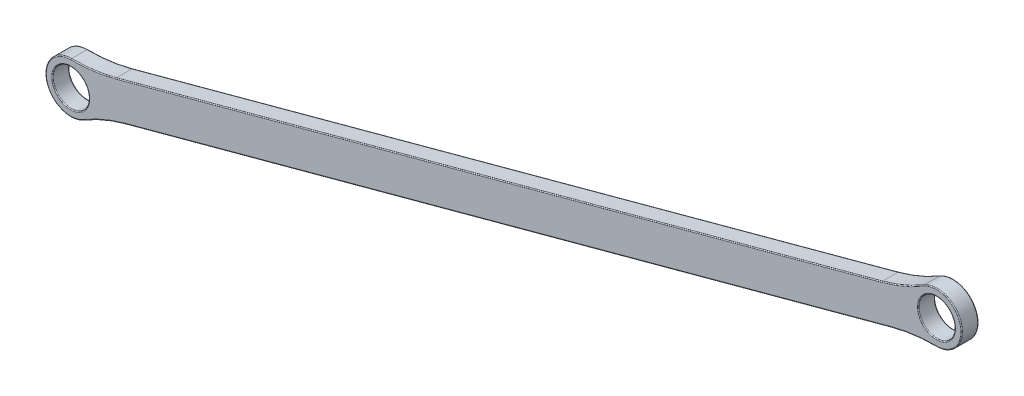
ISO-10303-21;
HEADER;
FILE_DESCRIPTION(('STEP AP214'),'2;1');
FILE_NAME('part.step','',(''),(''),'','','');
FILE_SCHEMA(('AUTOMOTIVE_DESIGN { 1 0 10303 214 1 1 1 1 }'));
ENDSEC;
DATA;
#1=APPLICATION_CONTEXT('core data for automotive mechanical design processes');
#2=APPLICATION_PROTOCOL_DEFINITION('international standard','automotive_design',2000,#1);
#3=PRODUCT_CONTEXT('',#1,'mechanical');
#4=PRODUCT('Part','Part','',(#3));
#5=PRODUCT_RELATED_PRODUCT_CATEGORY('part','',(#4));
#6=PRODUCT_DEFINITION_FORMATION('','',#4);
#7=PRODUCT_DEFINITION_CONTEXT('part definition',#1,'design');
#8=PRODUCT_DEFINITION('design','',#6,#7);
#9=PRODUCT_DEFINITION_SHAPE('','',#8);
#10=(LENGTH_UNIT() NAMED_UNIT(*) SI_UNIT(.MILLI.,.METRE.));
#11=(NAMED_UNIT(*) PLANE_ANGLE_UNIT() SI_UNIT($,.RADIAN.));
#12=(NAMED_UNIT(*) SI_UNIT($,.STERADIAN.) SOLID_ANGLE_UNIT());
#13=UNCERTAINTY_MEASURE_WITH_UNIT(LENGTH_MEASURE(1.E-05),#10,'distance_accuracy_value','');
#14=(GEOMETRIC_REPRESENTATION_CONTEXT(3) GLOBAL_UNCERTAINTY_ASSIGNED_CONTEXT((#13)) GLOBAL_UNIT_ASSIGNED_CONTEXT((#10,
#11,#12)) REPRESENTATION_CONTEXT('',''));
#15=CARTESIAN_POINT('',(0.,0.,0.));
#16=DIRECTION('',(0.,0.,1.));
#17=DIRECTION('',(1.,0.,0.));
#18=AXIS2_PLACEMENT_3D('',#15,#16,#17);
#19=CARTESIAN_POINT('',(-213.595931630714,188.0480555057,-3.));
#20=DIRECTION('',(0.,0.,1.));
#21=DIRECTION('',(1.,0.,0.));
#22=AXIS2_PLACEMENT_3D('',#19,#20,#21);
#23=CYLINDRICAL_SURFACE('',#22,4.49999999999999);
#24=DIRECTION('',(0.,0.,1.));
#25=VECTOR('',#24,1.);
#26=CARTESIAN_POINT('',(-213.568137790071,192.547969671817,-3.));
#27=LINE('',#26,#25);
#28=CARTESIAN_POINT('',(-213.568137790071,192.547969671817,-0.15));
#29=VERTEX_POINT('',#28);
#30=CARTESIAN_POINT('',(-213.568137790071,192.547969671817,-2.85));
#31=VERTEX_POINT('',#30);
#32=EDGE_CURVE('E306',#29,#31,#27,.F.);
#33=ORIENTED_EDGE('',*,*,#32,.T.);
#34=CARTESIAN_POINT('',(-213.595931630714,188.0480555057,-2.85));
#35=DIRECTION('',(0.,0.,1.));
#36=DIRECTION('',(1.,0.,0.));
#37=AXIS2_PLACEMENT_3D('',#34,#35,#36);
#38=CIRCLE('',#37,4.49999999999999);
#39=CARTESIAN_POINT('',(-211.306122055367,184.174197982681,-2.85));
#40=VERTEX_POINT('',#39);
#41=EDGE_CURVE('E221',#31,#40,#38,.T.);
#42=ORIENTED_EDGE('',*,*,#41,.T.);
#43=DIRECTION('',(0.,0.,1.));
#44=VECTOR('',#43,1.);
#45=CARTESIAN_POINT('',(-211.306122055367,184.174197982681,-3.));
#46=LINE('',#45,#44);
#47=CARTESIAN_POINT('',(-211.306122055367,184.174197982681,-0.15));
#48=VERTEX_POINT('',#47);
#49=EDGE_CURVE('E300',#40,#48,#46,.T.);
#50=ORIENTED_EDGE('',*,*,#49,.T.);
#51=CARTESIAN_POINT('',(-213.595931630714,188.0480555057,-0.15));
#52=DIRECTION('',(0.,0.,1.));
#53=DIRECTION('',(1.,0.,0.));
#54=AXIS2_PLACEMENT_3D('',#51,#52,#53);
#55=CIRCLE('',#54,4.49999999999999);
#56=EDGE_CURVE('E219',#48,#29,#55,.F.);
#57=ORIENTED_EDGE('',*,*,#56,.T.);
#58=EDGE_LOOP('',(#33,#42,#50,#57));
#59=FACE_BOUND('',#58,.T.);
#60=ADVANCED_FACE('F35',(#59),#23,.T.);
#61=CARTESIAN_POINT('',(-62.7167818612007,232.171688430651,-3.));
#62=DIRECTION('',(-0.260783768913293,0.965397237343974,0.));
#63=DIRECTION('',(-0.965397237343975,-0.260783768913293,0.));
#64=AXIS2_PLACEMENT_3D('',#61,#62,#63);
#65=PLANE('',#64);
#66=DIRECTION('',(0.,0.,-1.));
#67=VECTOR('',#66,1.);
#68=CARTESIAN_POINT('',(-68.8640673326091,230.51111575465,-3.));
#69=LINE('',#68,#67);
#70=CARTESIAN_POINT('',(-68.8640673326091,230.51111575465,-0.15));
#71=VERTEX_POINT('',#70);
#72=CARTESIAN_POINT('',(-68.8640673326091,230.51111575465,-2.85));
#73=VERTEX_POINT('',#72);
#74=EDGE_CURVE('E334',#71,#73,#69,.T.);
#75=ORIENTED_EDGE('',*,*,#74,.T.);
#76=DIRECTION('',(-0.965397237343975,-0.260783768913293,0.));
#77=VECTOR('',#76,1.);
#78=CARTESIAN_POINT('',(-205.55933245172,193.585480325613,-2.85));
#79=LINE('',#78,#77);
#80=CARTESIAN_POINT('',(-205.55933245172,193.585480325613,-2.85));
#81=VERTEX_POINT('',#80);
#82=EDGE_CURVE('E213',#73,#81,#79,.T.);
#83=ORIENTED_EDGE('',*,*,#82,.T.);
#84=DIRECTION('',(0.,0.,-1.));
#85=VECTOR('',#84,1.);
#86=CARTESIAN_POINT('',(-205.55933245172,193.585480325613,0.));
#87=LINE('',#86,#85);
#88=CARTESIAN_POINT('',(-205.55933245172,193.585480325613,-0.15));
#89=VERTEX_POINT('',#88);
#90=EDGE_CURVE('E337',#81,#89,#87,.F.);
#91=ORIENTED_EDGE('',*,*,#90,.T.);
#92=DIRECTION('',(-0.965397237343975,-0.260783768913293,0.));
#93=VECTOR('',#92,1.);
#94=CARTESIAN_POINT('',(-62.7167818612007,232.171688430651,-0.15));
#95=LINE('',#94,#93);
#96=EDGE_CURVE('E211',#89,#71,#95,.F.);
#97=ORIENTED_EDGE('',*,*,#96,.T.);
#98=EDGE_LOOP('',(#75,#83,#91,#97));
#99=FACE_BOUND('',#98,.T.);
#100=ADVANCED_FACE('F368',(#99),#65,.T.);
#101=CARTESIAN_POINT('',(-59.1323736556782,229.773458531827,-3.));
#102=DIRECTION('',(0.,0.,1.));
#103=DIRECTION('',(1.,0.,0.));
#104=AXIS2_PLACEMENT_3D('',#101,#102,#103);
#105=CYLINDRICAL_SURFACE('',#104,4.5);
#106=DIRECTION('',(0.,0.,1.));
#107=VECTOR('',#106,1.);
#108=CARTESIAN_POINT('',(-59.1601674963211,225.27354436571,-3.));
#109=LINE('',#108,#107);
#110=CARTESIAN_POINT('',(-59.1601674963211,225.27354436571,-0.15));
#111=VERTEX_POINT('',#110);
#112=CARTESIAN_POINT('',(-59.1601674963211,225.27354436571,-2.85));
#113=VERTEX_POINT('',#112);
#114=EDGE_CURVE('E262',#111,#113,#109,.F.);
#115=ORIENTED_EDGE('',*,*,#114,.T.);
#116=CARTESIAN_POINT('',(-59.1323736556782,229.773458531827,-2.85));
#117=DIRECTION('',(0.,0.,1.));
#118=DIRECTION('',(1.,0.,0.));
#119=AXIS2_PLACEMENT_3D('',#116,#117,#118);
#120=CIRCLE('',#119,4.5);
#121=CARTESIAN_POINT('',(-61.4221832310256,233.647316054845,-2.85));
#122=VERTEX_POINT('',#121);
#123=EDGE_CURVE('E204',#113,#122,#120,.T.);
#124=ORIENTED_EDGE('',*,*,#123,.T.);
#125=DIRECTION('',(0.,0.,1.));
#126=VECTOR('',#125,1.);
#127=CARTESIAN_POINT('',(-61.4221832310256,233.647316054845,-3.));
#128=LINE('',#127,#126);
#129=CARTESIAN_POINT('',(-61.4221832310256,233.647316054845,-0.15));
#130=VERTEX_POINT('',#129);
#131=EDGE_CURVE('E342',#122,#130,#128,.T.);
#132=ORIENTED_EDGE('',*,*,#131,.T.);
#133=CARTESIAN_POINT('',(-59.1323736556782,229.773458531827,-0.15));
#134=DIRECTION('',(0.,0.,1.));
#135=DIRECTION('',(1.,0.,0.));
#136=AXIS2_PLACEMENT_3D('',#133,#134,#135);
#137=CIRCLE('',#136,4.5);
#138=EDGE_CURVE('E202',#130,#111,#137,.F.);
#139=ORIENTED_EDGE('',*,*,#138,.T.);
#140=EDGE_LOOP('',(#115,#124,#132,#139));
#141=FACE_BOUND('',#140,.T.);
#142=ADVANCED_FACE('F349',(#141),#105,.T.);
#143=CARTESIAN_POINT('',(-61.0216873632643,225.896606387915,-3.));
#144=DIRECTION('',(-0.260783768913293,0.965397237343974,0.));
#145=DIRECTION('',(-0.965397237343975,-0.260783768913293,0.));
#146=AXIS2_PLACEMENT_3D('',#143,#144,#145);
#147=PLANE('',#146);
#148=DIRECTION('',(0.,0.,1.));
#149=VECTOR('',#148,1.);
#150=CARTESIAN_POINT('',(-203.864237953783,187.310398282877,-3.));
#151=LINE('',#150,#149);
#152=CARTESIAN_POINT('',(-203.864237953783,187.310398282877,-0.15));
#153=VERTEX_POINT('',#152);
#154=CARTESIAN_POINT('',(-203.864237953783,187.310398282877,-2.85));
#155=VERTEX_POINT('',#154);
#156=EDGE_CURVE('E302',#153,#155,#151,.F.);
#157=ORIENTED_EDGE('',*,*,#156,.T.);
#158=DIRECTION('',(-0.965397237343975,-0.260783768913293,0.));
#159=VECTOR('',#158,1.);
#160=CARTESIAN_POINT('',(-61.0216873632643,225.896606387915,-2.85));
#161=LINE('',#160,#159);
#162=CARTESIAN_POINT('',(-67.1689728346726,224.236033711914,-2.85));
#163=VERTEX_POINT('',#162);
#164=EDGE_CURVE('E196',#155,#163,#161,.F.);
#165=ORIENTED_EDGE('',*,*,#164,.T.);
#166=DIRECTION('',(0.,0.,1.));
#167=VECTOR('',#166,1.);
#168=CARTESIAN_POINT('',(-67.1689728346726,224.236033711914,-3.));
#169=LINE('',#168,#167);
#170=CARTESIAN_POINT('',(-67.1689728346726,224.236033711914,-0.15));
#171=VERTEX_POINT('',#170);
#172=EDGE_CURVE('E310',#163,#171,#169,.T.);
#173=ORIENTED_EDGE('',*,*,#172,.T.);
#174=DIRECTION('',(-0.965397237343975,-0.260783768913293,0.));
#175=VECTOR('',#174,1.);
#176=CARTESIAN_POINT('',(-203.864237953784,187.310398282877,-0.15));
#177=LINE('',#176,#175);
#178=EDGE_CURVE('E194',#171,#153,#177,.T.);
#179=ORIENTED_EDGE('',*,*,#178,.T.);
#180=EDGE_LOOP('',(#157,#165,#173,#179));
#181=FACE_BOUND('',#180,.T.);
#182=ADVANCED_FACE('F333',(#181),#147,.F.);
#183=CARTESIAN_POINT('',(-213.595931630714,188.0480555057,-3.));
#184=DIRECTION('',(0.,0.,1.));
#185=DIRECTION('',(1.,0.,0.));
#186=AXIS2_PLACEMENT_3D('',#183,#184,#185);
#187=CYLINDRICAL_SURFACE('',#186,3.25);
#188=CARTESIAN_POINT('',(-213.595931630714,188.0480555057,-2.85));
#189=DIRECTION('',(0.,0.,1.));
#190=DIRECTION('',(1.,0.,0.));
#191=AXIS2_PLACEMENT_3D('',#188,#189,#190);
#192=CIRCLE('',#191,3.25);
#193=CARTESIAN_POINT('',(-210.345931630714,188.0480555057,-2.85));
#194=VERTEX_POINT('',#193);
#195=EDGE_CURVE('E226',#194,#194,#192,.F.);
#196=ORIENTED_EDGE('',*,*,#195,.T.);
#197=EDGE_LOOP('',(#196));
#198=FACE_BOUND('',#197,.T.);
#199=CARTESIAN_POINT('',(-213.595931630714,188.0480555057,-0.15));
#200=DIRECTION('',(0.,0.,1.));
#201=DIRECTION('',(1.,0.,0.));
#202=AXIS2_PLACEMENT_3D('',#199,#200,#201);
#203=CIRCLE('',#202,3.25);
#204=CARTESIAN_POINT('',(-210.345931630714,188.0480555057,-0.15));
#205=VERTEX_POINT('',#204);
#206=EDGE_CURVE('E223',#205,#205,#203,.T.);
#207=ORIENTED_EDGE('',*,*,#206,.T.);
#208=EDGE_LOOP('',(#207));
#209=FACE_BOUND('',#208,.T.);
#210=ADVANCED_FACE('F403',(#198,#209),#187,.F.);
#211=CARTESIAN_POINT('',(-59.1323736556782,229.773458531827,-3.));
#212=DIRECTION('',(0.,0.,1.));
#213=DIRECTION('',(1.,0.,0.));
#214=AXIS2_PLACEMENT_3D('',#211,#212,#213);
#215=CYLINDRICAL_SURFACE('',#214,3.25);
#216=CARTESIAN_POINT('',(-59.1323736556782,229.773458531827,-2.85));
#217=DIRECTION('',(0.,0.,1.));
#218=DIRECTION('',(1.,0.,0.));
#219=AXIS2_PLACEMENT_3D('',#216,#217,#218);
#220=CIRCLE('',#219,3.25);
#221=CARTESIAN_POINT('',(-55.8823736556782,229.773458531827,-2.85));
#222=VERTEX_POINT('',#221);
#223=EDGE_CURVE('E188',#222,#222,#220,.F.);
#224=ORIENTED_EDGE('',*,*,#223,.T.);
#225=EDGE_LOOP('',(#224));
#226=FACE_BOUND('',#225,.T.);
#227=CARTESIAN_POINT('',(-59.1323736556782,229.773458531827,-0.15));
#228=DIRECTION('',(0.,0.,1.));
#229=DIRECTION('',(1.,0.,0.));
#230=AXIS2_PLACEMENT_3D('',#227,#228,#229);
#231=CIRCLE('',#230,3.25);
#232=CARTESIAN_POINT('',(-55.8823736556782,229.773458531827,-0.15));
#233=VERTEX_POINT('',#232);
#234=EDGE_CURVE('E180',#233,#233,#231,.T.);
#235=ORIENTED_EDGE('',*,*,#234,.T.);
#236=EDGE_LOOP('',(#235));
#237=FACE_BOUND('',#236,.T.);
#238=ADVANCED_FACE('F405',(#226,#237),#215,.F.);
#239=CARTESIAN_POINT('',(0.,0.,-3.));
#240=DIRECTION('',(0.,0.,1.));
#241=DIRECTION('',(1.,0.,0.));
#242=AXIS2_PLACEMENT_3D('',#239,#240,#241);
#243=PLANE('',#242);
#244=CARTESIAN_POINT('',(-59.1323736556782,229.773458531827,-3.));
#245=DIRECTION('',(0.,0.,1.));
#246=DIRECTION('',(1.,0.,0.));
#247=AXIS2_PLACEMENT_3D('',#244,#245,#246);
#248=CIRCLE('',#247,3.4);
#249=CARTESIAN_POINT('',(-55.7323736556782,229.773458531827,-3.));
#250=VERTEX_POINT('',#249);
#251=EDGE_CURVE('E177',#250,#250,#248,.T.);
#252=ORIENTED_EDGE('',*,*,#251,.T.);
#253=EDGE_LOOP('',(#252));
#254=FACE_BOUND('',#253,.T.);
#255=DIRECTION('',(-0.965397237343975,-0.260783768913293,0.));
#256=VECTOR('',#255,1.);
#257=CARTESIAN_POINT('',(-61.0608049286013,226.041415973516,-3.));
#258=LINE('',#257,#256);
#259=CARTESIAN_POINT('',(-67.2080904000096,224.380843297516,-3.));
#260=VERTEX_POINT('',#259);
#261=CARTESIAN_POINT('',(-203.90335551912,187.455207868478,-3.));
#262=VERTEX_POINT('',#261);
#263=EDGE_CURVE('E175',#260,#262,#258,.T.);
#264=ORIENTED_EDGE('',*,*,#263,.T.);
#265=CARTESIAN_POINT('',(-196.040724886385,158.348481162557,-3.));
#266=DIRECTION('',(0.,0.,1.));
#267=DIRECTION('',(1.,0.,0.));
#268=AXIS2_PLACEMENT_3D('',#265,#266,#267);
#269=CIRCLE('',#268,30.15);
#270=CARTESIAN_POINT('',(-211.382449041212,184.303326566782,-3.));
#271=VERTEX_POINT('',#270);
#272=EDGE_CURVE('E155',#262,#271,#269,.T.);
#273=ORIENTED_EDGE('',*,*,#272,.T.);
#274=CARTESIAN_POINT('',(-213.595931630714,188.0480555057,-3.));
#275=DIRECTION('',(0.,0.,1.));
#276=DIRECTION('',(1.,0.,0.));
#277=AXIS2_PLACEMENT_3D('',#274,#275,#276);
#278=CIRCLE('',#277,4.34999999999999);
#279=CARTESIAN_POINT('',(-213.569064251426,192.397972532947,-3.));
#280=VERTEX_POINT('',#279);
#281=EDGE_CURVE('E163',#271,#280,#278,.F.);
#282=ORIENTED_EDGE('',*,*,#281,.T.);
#283=CARTESIAN_POINT('',(-213.382845519119,222.547397445932,-3.));
#284=DIRECTION('',(0.,0.,1.));
#285=DIRECTION('',(1.,0.,0.));
#286=AXIS2_PLACEMENT_3D('',#283,#284,#285);
#287=CIRCLE('',#286,30.15);
#288=CARTESIAN_POINT('',(-205.520214886383,193.440670740011,-3.));
#289=VERTEX_POINT('',#288);
#290=EDGE_CURVE('E169',#280,#289,#287,.T.);
#291=ORIENTED_EDGE('',*,*,#290,.T.);
#292=DIRECTION('',(-0.965397237343975,-0.260783768913293,0.));
#293=VECTOR('',#292,1.);
#294=CARTESIAN_POINT('',(-68.8249497672721,230.366306169048,-3.));
#295=LINE('',#294,#293);
#296=CARTESIAN_POINT('',(-68.8249497672721,230.366306169048,-3.));
#297=VERTEX_POINT('',#296);
#298=EDGE_CURVE('E315',#289,#297,#295,.F.);
#299=ORIENTED_EDGE('',*,*,#298,.T.);
#300=CARTESIAN_POINT('',(-76.6875804000079,259.473032874969,-3.));
#301=DIRECTION('',(0.,0.,1.));
#302=DIRECTION('',(1.,0.,0.));
#303=AXIS2_PLACEMENT_3D('',#300,#301,#302);
#304=CIRCLE('',#303,30.15);
#305=CARTESIAN_POINT('',(-61.3458562451806,233.518187470745,-3.));
#306=VERTEX_POINT('',#305);
#307=EDGE_CURVE('E317',#297,#306,#304,.T.);
#308=ORIENTED_EDGE('',*,*,#307,.T.);
#309=CARTESIAN_POINT('',(-59.1323736556782,229.773458531827,-3.));
#310=DIRECTION('',(0.,0.,1.));
#311=DIRECTION('',(1.,0.,0.));
#312=AXIS2_PLACEMENT_3D('',#309,#310,#311);
#313=CIRCLE('',#312,4.35);
#314=CARTESIAN_POINT('',(-59.1592410349663,225.42354150458,-3.));
#315=VERTEX_POINT('',#314);
#316=EDGE_CURVE('E319',#306,#315,#313,.F.);
#317=ORIENTED_EDGE('',*,*,#316,.T.);
#318=CARTESIAN_POINT('',(-59.3454597672738,195.274116591595,-3.));
#319=DIRECTION('',(0.,0.,1.));
#320=DIRECTION('',(1.,0.,0.));
#321=AXIS2_PLACEMENT_3D('',#318,#319,#320);
#322=CIRCLE('',#321,30.15);
#323=EDGE_CURVE('E182',#315,#260,#322,.T.);
#324=ORIENTED_EDGE('',*,*,#323,.T.);
#325=EDGE_LOOP('',(#264,#273,#282,#291,#299,#308,#317,#324));
#326=FACE_BOUND('',#325,.T.);
#327=CARTESIAN_POINT('',(-213.595931630714,188.0480555057,-3.));
#328=DIRECTION('',(0.,0.,1.));
#329=DIRECTION('',(1.,0.,0.));
#330=AXIS2_PLACEMENT_3D('',#327,#328,#329);
#331=CIRCLE('',#330,3.4);
#332=CARTESIAN_POINT('',(-210.195931630714,188.0480555057,-3.));
#333=VERTEX_POINT('',#332);
#334=EDGE_CURVE('E170',#333,#333,#331,.T.);
#335=ORIENTED_EDGE('',*,*,#334,.T.);
#336=EDGE_LOOP('',(#335));
#337=FACE_BOUND('',#336,.T.);
#338=ADVANCED_FACE('F172',(#254,#326,#337),#243,.F.);
#339=CARTESIAN_POINT('',(0.,0.,0.));
#340=DIRECTION('',(0.,0.,1.));
#341=DIRECTION('',(1.,0.,0.));
#342=AXIS2_PLACEMENT_3D('',#339,#340,#341);
#343=PLANE('',#342);
#344=CARTESIAN_POINT('',(-59.1323736556782,229.773458531827,0.));
#345=DIRECTION('',(0.,0.,1.));
#346=DIRECTION('',(1.,0.,0.));
#347=AXIS2_PLACEMENT_3D('',#344,#345,#346);
#348=CIRCLE('',#347,3.4);
#349=CARTESIAN_POINT('',(-55.7323736556782,229.773458531827,0.));
#350=VERTEX_POINT('',#349);
#351=EDGE_CURVE('E11',#350,#350,#348,.F.);
#352=ORIENTED_EDGE('',*,*,#351,.T.);
#353=EDGE_LOOP('',(#352));
#354=FACE_BOUND('',#353,.T.);
#355=CARTESIAN_POINT('',(-59.1323736556782,229.773458531827,0.));
#356=DIRECTION('',(0.,0.,1.));
#357=DIRECTION('',(1.,0.,0.));
#358=AXIS2_PLACEMENT_3D('',#355,#356,#357);
#359=CIRCLE('',#358,4.35);
#360=CARTESIAN_POINT('',(-59.1592410349663,225.42354150458,0.));
#361=VERTEX_POINT('',#360);
#362=CARTESIAN_POINT('',(-61.3458562451806,233.518187470745,0.));
#363=VERTEX_POINT('',#362);
#364=EDGE_CURVE('E52',#361,#363,#359,.T.);
#365=ORIENTED_EDGE('',*,*,#364,.T.);
#366=CARTESIAN_POINT('',(-76.6875804000079,259.473032874969,0.));
#367=DIRECTION('',(0.,0.,1.));
#368=DIRECTION('',(1.,0.,0.));
#369=AXIS2_PLACEMENT_3D('',#366,#367,#368);
#370=CIRCLE('',#369,30.15);
#371=CARTESIAN_POINT('',(-68.8249497672721,230.366306169048,0.));
#372=VERTEX_POINT('',#371);
#373=EDGE_CURVE('E44',#363,#372,#370,.F.);
#374=ORIENTED_EDGE('',*,*,#373,.T.);
#375=DIRECTION('',(-0.965397237343975,-0.260783768913293,0.));
#376=VECTOR('',#375,1.);
#377=CARTESIAN_POINT('',(-62.6776642958637,232.026878845049,0.));
#378=LINE('',#377,#376);
#379=CARTESIAN_POINT('',(-205.520214886383,193.440670740011,0.));
#380=VERTEX_POINT('',#379);
#381=EDGE_CURVE('E232',#372,#380,#378,.T.);
#382=ORIENTED_EDGE('',*,*,#381,.T.);
#383=CARTESIAN_POINT('',(-213.382845519119,222.547397445932,0.));
#384=DIRECTION('',(0.,0.,1.));
#385=DIRECTION('',(1.,0.,0.));
#386=AXIS2_PLACEMENT_3D('',#383,#384,#385);
#387=CIRCLE('',#386,30.15);
#388=CARTESIAN_POINT('',(-213.569064251426,192.397972532947,0.));
#389=VERTEX_POINT('',#388);
#390=EDGE_CURVE('E234',#380,#389,#387,.F.);
#391=ORIENTED_EDGE('',*,*,#390,.T.);
#392=CARTESIAN_POINT('',(-213.595931630714,188.0480555057,0.));
#393=DIRECTION('',(0.,0.,1.));
#394=DIRECTION('',(1.,0.,0.));
#395=AXIS2_PLACEMENT_3D('',#392,#393,#394);
#396=CIRCLE('',#395,4.34999999999999);
#397=CARTESIAN_POINT('',(-211.382449041212,184.303326566782,0.));
#398=VERTEX_POINT('',#397);
#399=EDGE_CURVE('E236',#389,#398,#396,.T.);
#400=ORIENTED_EDGE('',*,*,#399,.T.);
#401=CARTESIAN_POINT('',(-196.040724886385,158.348481162557,0.));
#402=DIRECTION('',(0.,0.,1.));
#403=DIRECTION('',(1.,0.,0.));
#404=AXIS2_PLACEMENT_3D('',#401,#402,#403);
#405=CIRCLE('',#404,30.15);
#406=CARTESIAN_POINT('',(-203.90335551912,187.455207868478,0.));
#407=VERTEX_POINT('',#406);
#408=EDGE_CURVE('E238',#398,#407,#405,.F.);
#409=ORIENTED_EDGE('',*,*,#408,.T.);
#410=DIRECTION('',(-0.965397237343975,-0.260783768913293,0.));
#411=VECTOR('',#410,1.);
#412=CARTESIAN_POINT('',(-67.2080904000096,224.380843297516,0.));
#413=LINE('',#412,#411);
#414=CARTESIAN_POINT('',(-67.2080904000096,224.380843297516,0.));
#415=VERTEX_POINT('',#414);
#416=EDGE_CURVE('E240',#407,#415,#413,.F.);
#417=ORIENTED_EDGE('',*,*,#416,.T.);
#418=CARTESIAN_POINT('',(-59.3454597672738,195.274116591595,0.));
#419=DIRECTION('',(0.,0.,1.));
#420=DIRECTION('',(1.,0.,0.));
#421=AXIS2_PLACEMENT_3D('',#418,#419,#420);
#422=CIRCLE('',#421,30.15);
#423=EDGE_CURVE('E57',#415,#361,#422,.F.);
#424=ORIENTED_EDGE('',*,*,#423,.T.);
#425=EDGE_LOOP('',(#365,#374,#382,#391,#400,#409,#417,#424));
#426=FACE_BOUND('',#425,.T.);
#427=CARTESIAN_POINT('',(-213.595931630714,188.0480555057,0.));
#428=DIRECTION('',(0.,0.,1.));
#429=DIRECTION('',(1.,0.,0.));
#430=AXIS2_PLACEMENT_3D('',#427,#428,#429);
#431=CIRCLE('',#430,3.4);
#432=CARTESIAN_POINT('',(-210.195931630714,188.0480555057,0.));
#433=VERTEX_POINT('',#432);
#434=EDGE_CURVE('E229',#433,#433,#431,.F.);
#435=ORIENTED_EDGE('',*,*,#434,.T.);
#436=EDGE_LOOP('',(#435));
#437=FACE_BOUND('',#436,.T.);
#438=ADVANCED_FACE('F392',(#354,#426,#437),#343,.T.);
#439=CARTESIAN_POINT('',(-76.6875804000079,259.473032874969,-3.));
#440=DIRECTION('',(0.,0.,1.));
#441=DIRECTION('',(1.,0.,0.));
#442=AXIS2_PLACEMENT_3D('',#439,#440,#441);
#443=CYLINDRICAL_SURFACE('',#442,30.);
#444=ORIENTED_EDGE('',*,*,#131,.F.);
#445=CARTESIAN_POINT('',(-76.6875804000079,259.473032874969,-2.85));
#446=DIRECTION('',(0.,0.,1.));
#447=DIRECTION('',(1.,0.,0.));
#448=AXIS2_PLACEMENT_3D('',#445,#446,#447);
#449=CIRCLE('',#448,30.);
#450=EDGE_CURVE('E209',#122,#73,#449,.F.);
#451=ORIENTED_EDGE('',*,*,#450,.T.);
#452=ORIENTED_EDGE('',*,*,#74,.F.);
#453=CARTESIAN_POINT('',(-76.6875804000079,259.473032874969,-0.15));
#454=DIRECTION('',(0.,0.,1.));
#455=DIRECTION('',(1.,0.,0.));
#456=AXIS2_PLACEMENT_3D('',#453,#454,#455);
#457=CIRCLE('',#456,30.);
#458=EDGE_CURVE('E206',#71,#130,#457,.T.);
#459=ORIENTED_EDGE('',*,*,#458,.T.);
#460=EDGE_LOOP('',(#444,#451,#452,#459));
#461=FACE_BOUND('',#460,.T.);
#462=ADVANCED_FACE('F365',(#461),#443,.F.);
#463=CARTESIAN_POINT('',(-59.3454597672738,195.274116591595,-3.));
#464=DIRECTION('',(0.,0.,1.));
#465=DIRECTION('',(1.,0.,0.));
#466=AXIS2_PLACEMENT_3D('',#463,#464,#465);
#467=CYLINDRICAL_SURFACE('',#466,30.);
#468=ORIENTED_EDGE('',*,*,#172,.F.);
#469=CARTESIAN_POINT('',(-59.3454597672738,195.274116591595,-2.85));
#470=DIRECTION('',(0.,0.,1.));
#471=DIRECTION('',(1.,0.,0.));
#472=AXIS2_PLACEMENT_3D('',#469,#470,#471);
#473=CIRCLE('',#472,30.);
#474=EDGE_CURVE('E200',#163,#113,#473,.F.);
#475=ORIENTED_EDGE('',*,*,#474,.T.);
#476=ORIENTED_EDGE('',*,*,#114,.F.);
#477=CARTESIAN_POINT('',(-59.3454597672738,195.274116591595,-0.15));
#478=DIRECTION('',(0.,0.,1.));
#479=DIRECTION('',(1.,0.,0.));
#480=AXIS2_PLACEMENT_3D('',#477,#478,#479);
#481=CIRCLE('',#480,30.);
#482=EDGE_CURVE('E198',#111,#171,#481,.T.);
#483=ORIENTED_EDGE('',*,*,#482,.T.);
#484=EDGE_LOOP('',(#468,#475,#476,#483));
#485=FACE_BOUND('',#484,.T.);
#486=ADVANCED_FACE('F383',(#485),#467,.F.);
#487=CARTESIAN_POINT('',(-196.040724886385,158.348481162557,-3.));
#488=DIRECTION('',(0.,0.,1.));
#489=DIRECTION('',(1.,0.,0.));
#490=AXIS2_PLACEMENT_3D('',#487,#488,#489);
#491=CYLINDRICAL_SURFACE('',#490,30.);
#492=ORIENTED_EDGE('',*,*,#49,.F.);
#493=CARTESIAN_POINT('',(-196.040724886385,158.348481162557,-2.85));
#494=DIRECTION('',(0.,0.,1.));
#495=DIRECTION('',(1.,0.,0.));
#496=AXIS2_PLACEMENT_3D('',#493,#494,#495);
#497=CIRCLE('',#496,30.);
#498=EDGE_CURVE('E157',#40,#155,#497,.F.);
#499=ORIENTED_EDGE('',*,*,#498,.T.);
#500=ORIENTED_EDGE('',*,*,#156,.F.);
#501=CARTESIAN_POINT('',(-196.040724886385,158.348481162557,-0.15));
#502=DIRECTION('',(0.,0.,1.));
#503=DIRECTION('',(1.,0.,0.));
#504=AXIS2_PLACEMENT_3D('',#501,#502,#503);
#505=CIRCLE('',#504,30.);
#506=EDGE_CURVE('E191',#153,#48,#505,.T.);
#507=ORIENTED_EDGE('',*,*,#506,.T.);
#508=EDGE_LOOP('',(#492,#499,#500,#507));
#509=FACE_BOUND('',#508,.T.);
#510=ADVANCED_FACE('F299',(#509),#491,.F.);
#511=CARTESIAN_POINT('',(-213.382845519119,222.547397445932,-3.));
#512=DIRECTION('',(0.,0.,1.));
#513=DIRECTION('',(1.,0.,0.));
#514=AXIS2_PLACEMENT_3D('',#511,#512,#513);
#515=CYLINDRICAL_SURFACE('',#514,30.);
#516=ORIENTED_EDGE('',*,*,#90,.F.);
#517=CARTESIAN_POINT('',(-213.382845519119,222.547397445932,-2.85));
#518=DIRECTION('',(0.,0.,1.));
#519=DIRECTION('',(1.,0.,0.));
#520=AXIS2_PLACEMENT_3D('',#517,#518,#519);
#521=CIRCLE('',#520,30.);
#522=EDGE_CURVE('E217',#81,#31,#521,.F.);
#523=ORIENTED_EDGE('',*,*,#522,.T.);
#524=ORIENTED_EDGE('',*,*,#32,.F.);
#525=CARTESIAN_POINT('',(-213.382845519119,222.547397445932,-0.15));
#526=DIRECTION('',(0.,0.,1.));
#527=DIRECTION('',(1.,0.,0.));
#528=AXIS2_PLACEMENT_3D('',#525,#526,#527);
#529=CIRCLE('',#528,30.);
#530=EDGE_CURVE('E215',#29,#89,#529,.T.);
#531=ORIENTED_EDGE('',*,*,#530,.T.);
#532=EDGE_LOOP('',(#516,#523,#524,#531));
#533=FACE_BOUND('',#532,.T.);
#534=ADVANCED_FACE('F390',(#533),#515,.F.);
#535=CARTESIAN_POINT('',(-59.1323736556782,229.773458531827,-2.85));
#536=DIRECTION('',(0.,0.,1.));
#537=DIRECTION('',(1.,0.,0.));
#538=AXIS2_PLACEMENT_3D('',#535,#536,#537);
#539=TOROIDAL_SURFACE('',#538,3.4,0.15);
#540=ORIENTED_EDGE('',*,*,#223,.F.);
#541=EDGE_LOOP('',(#540));
#542=FACE_BOUND('',#541,.T.);
#543=ORIENTED_EDGE('',*,*,#251,.F.);
#544=EDGE_LOOP('',(#543));
#545=FACE_BOUND('',#544,.T.);
#546=ADVANCED_FACE('F489',(#542,#545),#539,.T.);
#547=CARTESIAN_POINT('',(-76.6875804000079,259.473032874969,-2.85));
#548=DIRECTION('',(0.,0.,1.));
#549=DIRECTION('',(1.,0.,0.));
#550=AXIS2_PLACEMENT_3D('',#547,#548,#549);
#551=TOROIDAL_SURFACE('',#550,30.15,0.15);
#552=CARTESIAN_POINT('',(-68.8249497672721,230.366306169048,-2.85));
#553=DIRECTION('',(-0.965397237343977,-0.260783768913282,0.));
#554=DIRECTION('',(0.260783768913282,-0.965397237343977,0.));
#555=AXIS2_PLACEMENT_3D('',#552,#553,#554);
#556=CIRCLE('',#555,0.15);
#557=EDGE_CURVE('E256',#73,#297,#556,.T.);
#558=ORIENTED_EDGE('',*,*,#557,.F.);
#559=ORIENTED_EDGE('',*,*,#450,.F.);
#560=CARTESIAN_POINT('',(-61.3458562451806,233.518187470745,-2.85));
#561=DIRECTION('',(0.860857227337413,0.508846572299492,0.));
#562=DIRECTION('',(-0.508846572299492,0.860857227337413,0.));
#563=AXIS2_PLACEMENT_3D('',#560,#561,#562);
#564=CIRCLE('',#563,0.15);
#565=EDGE_CURVE('E259',#306,#122,#564,.T.);
#566=ORIENTED_EDGE('',*,*,#565,.F.);
#567=ORIENTED_EDGE('',*,*,#307,.F.);
#568=EDGE_LOOP('',(#558,#559,#566,#567));
#569=FACE_BOUND('',#568,.T.);
#570=ADVANCED_FACE('F361',(#569),#551,.T.);
#571=CARTESIAN_POINT('',(-59.1323736556782,229.773458531827,-2.85));
#572=DIRECTION('',(0.,0.,1.));
#573=DIRECTION('',(1.,0.,0.));
#574=AXIS2_PLACEMENT_3D('',#571,#572,#573);
#575=TOROIDAL_SURFACE('',#574,4.35,0.15);
#576=ORIENTED_EDGE('',*,*,#565,.T.);
#577=ORIENTED_EDGE('',*,*,#123,.F.);
#578=CARTESIAN_POINT('',(-59.1592410349663,225.42354150458,-2.85));
#579=DIRECTION('',(-0.999980925803824,0.00617640903176832,0.));
#580=DIRECTION('',(-0.00617640903176832,-0.999980925803824,0.));
#581=AXIS2_PLACEMENT_3D('',#578,#579,#580);
#582=CIRCLE('',#581,0.15);
#583=EDGE_CURVE('E253',#315,#113,#582,.T.);
#584=ORIENTED_EDGE('',*,*,#583,.F.);
#585=ORIENTED_EDGE('',*,*,#316,.F.);
#586=EDGE_LOOP('',(#576,#577,#584,#585));
#587=FACE_BOUND('',#586,.T.);
#588=ADVANCED_FACE('F355',(#587),#575,.T.);
#589=CARTESIAN_POINT('',(-62.6776642958637,232.026878845049,-2.85));
#590=DIRECTION('',(0.965397237343975,0.260783768913293,0.));
#591=DIRECTION('',(-0.260783768913293,0.965397237343974,0.));
#592=AXIS2_PLACEMENT_3D('',#589,#590,#591);
#593=CYLINDRICAL_SURFACE('',#592,0.15);
#594=ORIENTED_EDGE('',*,*,#557,.T.);
#595=ORIENTED_EDGE('',*,*,#298,.F.);
#596=CARTESIAN_POINT('',(-205.520214886383,193.440670740011,-2.85));
#597=DIRECTION('',(-0.965397237343954,-0.260783768913368,0.));
#598=DIRECTION('',(0.260783768913368,-0.965397237343954,0.));
#599=AXIS2_PLACEMENT_3D('',#596,#597,#598);
#600=CIRCLE('',#599,0.15);
#601=EDGE_CURVE('E250',#81,#289,#600,.T.);
#602=ORIENTED_EDGE('',*,*,#601,.F.);
#603=ORIENTED_EDGE('',*,*,#82,.F.);
#604=EDGE_LOOP('',(#594,#595,#602,#603));
#605=FACE_BOUND('',#604,.T.);
#606=ADVANCED_FACE('F516',(#605),#593,.T.);
#607=CARTESIAN_POINT('',(-59.3454597672738,195.274116591595,-2.85));
#608=DIRECTION('',(0.,0.,1.));
#609=DIRECTION('',(1.,0.,0.));
#610=AXIS2_PLACEMENT_3D('',#607,#608,#609);
#611=TOROIDAL_SURFACE('',#610,30.15,0.15);
#612=ORIENTED_EDGE('',*,*,#583,.T.);
#613=ORIENTED_EDGE('',*,*,#474,.F.);
#614=CARTESIAN_POINT('',(-67.2080904000096,224.380843297516,-2.85));
#615=DIRECTION('',(-0.965397237343977,-0.260783768913282,0.));
#616=DIRECTION('',(0.260783768913282,-0.965397237343977,0.));
#617=AXIS2_PLACEMENT_3D('',#614,#615,#616);
#618=CIRCLE('',#617,0.15);
#619=EDGE_CURVE('E247',#260,#163,#618,.T.);
#620=ORIENTED_EDGE('',*,*,#619,.F.);
#621=ORIENTED_EDGE('',*,*,#323,.F.);
#622=EDGE_LOOP('',(#612,#613,#620,#621));
#623=FACE_BOUND('',#622,.T.);
#624=ADVANCED_FACE('F326',(#623),#611,.T.);
#625=CARTESIAN_POINT('',(-213.382845519119,222.547397445932,-2.85));
#626=DIRECTION('',(0.,0.,1.));
#627=DIRECTION('',(1.,0.,0.));
#628=AXIS2_PLACEMENT_3D('',#625,#626,#627);
#629=TOROIDAL_SURFACE('',#628,30.15,0.15);
#630=ORIENTED_EDGE('',*,*,#601,.T.);
#631=ORIENTED_EDGE('',*,*,#290,.F.);
#632=CARTESIAN_POINT('',(-213.569064251426,192.397972532947,-2.85));
#633=DIRECTION('',(-0.999980925803823,0.00617640903181458,0.));
#634=DIRECTION('',(-0.00617640903181458,-0.999980925803823,0.));
#635=AXIS2_PLACEMENT_3D('',#632,#633,#634);
#636=CIRCLE('',#635,0.15);
#637=EDGE_CURVE('E166',#31,#280,#636,.T.);
#638=ORIENTED_EDGE('',*,*,#637,.F.);
#639=ORIENTED_EDGE('',*,*,#522,.F.);
#640=EDGE_LOOP('',(#630,#631,#638,#639));
#641=FACE_BOUND('',#640,.T.);
#642=ADVANCED_FACE('F534',(#641),#629,.T.);
#643=CARTESIAN_POINT('',(-61.0608049286013,226.041415973516,-2.85));
#644=DIRECTION('',(-0.965397237343975,-0.260783768913293,0.));
#645=DIRECTION('',(0.260783768913293,-0.965397237343974,0.));
#646=AXIS2_PLACEMENT_3D('',#643,#644,#645);
#647=CYLINDRICAL_SURFACE('',#646,0.15);
#648=ORIENTED_EDGE('',*,*,#619,.T.);
#649=ORIENTED_EDGE('',*,*,#164,.F.);
#650=CARTESIAN_POINT('',(-203.90335551912,187.455207868478,-2.85));
#651=DIRECTION('',(-0.965397237343942,-0.260783768913415,0.));
#652=DIRECTION('',(0.260783768913415,-0.965397237343942,0.));
#653=AXIS2_PLACEMENT_3D('',#650,#651,#652);
#654=CIRCLE('',#653,0.15);
#655=EDGE_CURVE('E160',#262,#155,#654,.T.);
#656=ORIENTED_EDGE('',*,*,#655,.F.);
#657=ORIENTED_EDGE('',*,*,#263,.F.);
#658=EDGE_LOOP('',(#648,#649,#656,#657));
#659=FACE_BOUND('',#658,.T.);
#660=ADVANCED_FACE('F329',(#659),#647,.T.);
#661=CARTESIAN_POINT('',(-213.595931630714,188.0480555057,-2.85));
#662=DIRECTION('',(0.,0.,1.));
#663=DIRECTION('',(1.,0.,0.));
#664=AXIS2_PLACEMENT_3D('',#661,#662,#663);
#665=TOROIDAL_SURFACE('',#664,4.34999999999999,0.15);
#666=ORIENTED_EDGE('',*,*,#637,.T.);
#667=ORIENTED_EDGE('',*,*,#281,.F.);
#668=CARTESIAN_POINT('',(-211.382449041212,184.303326566782,-2.85));
#669=DIRECTION('',(0.860857227337413,0.508846572299492,0.));
#670=DIRECTION('',(-0.508846572299492,0.860857227337413,0.));
#671=AXIS2_PLACEMENT_3D('',#668,#669,#670);
#672=CIRCLE('',#671,0.15);
#673=EDGE_CURVE('E151',#40,#271,#672,.T.);
#674=ORIENTED_EDGE('',*,*,#673,.F.);
#675=ORIENTED_EDGE('',*,*,#41,.F.);
#676=EDGE_LOOP('',(#666,#667,#674,#675));
#677=FACE_BOUND('',#676,.T.);
#678=ADVANCED_FACE('F164',(#677),#665,.T.);
#679=CARTESIAN_POINT('',(-196.040724886385,158.348481162557,-2.85));
#680=DIRECTION('',(0.,0.,1.));
#681=DIRECTION('',(1.,0.,0.));
#682=AXIS2_PLACEMENT_3D('',#679,#680,#681);
#683=TOROIDAL_SURFACE('',#682,30.15,0.15);
#684=ORIENTED_EDGE('',*,*,#655,.T.);
#685=ORIENTED_EDGE('',*,*,#498,.F.);
#686=ORIENTED_EDGE('',*,*,#673,.T.);
#687=ORIENTED_EDGE('',*,*,#272,.F.);
#688=EDGE_LOOP('',(#684,#685,#686,#687));
#689=FACE_BOUND('',#688,.T.);
#690=ADVANCED_FACE('F153',(#689),#683,.T.);
#691=CARTESIAN_POINT('',(-213.595931630714,188.0480555057,-2.85));
#692=DIRECTION('',(0.,0.,1.));
#693=DIRECTION('',(1.,0.,0.));
#694=AXIS2_PLACEMENT_3D('',#691,#692,#693);
#695=TOROIDAL_SURFACE('',#694,3.4,0.15);
#696=ORIENTED_EDGE('',*,*,#334,.F.);
#697=EDGE_LOOP('',(#696));
#698=FACE_BOUND('',#697,.T.);
#699=ORIENTED_EDGE('',*,*,#195,.F.);
#700=EDGE_LOOP('',(#699));
#701=FACE_BOUND('',#700,.T.);
#702=ADVANCED_FACE('F568',(#698,#701),#695,.T.);
#703=CARTESIAN_POINT('',(-59.1323736556782,229.773458531827,-0.15));
#704=DIRECTION('',(0.,0.,1.));
#705=DIRECTION('',(1.,0.,0.));
#706=AXIS2_PLACEMENT_3D('',#703,#704,#705);
#707=TOROIDAL_SURFACE('',#706,3.4,0.15);
#708=ORIENTED_EDGE('',*,*,#351,.F.);
#709=EDGE_LOOP('',(#708));
#710=FACE_BOUND('',#709,.T.);
#711=ORIENTED_EDGE('',*,*,#234,.F.);
#712=EDGE_LOOP('',(#711));
#713=FACE_BOUND('',#712,.T.);
#714=ADVANCED_FACE('F577',(#710,#713),#707,.T.);
#715=CARTESIAN_POINT('',(-196.040724886385,158.348481162557,-0.15));
#716=DIRECTION('',(0.,0.,1.));
#717=DIRECTION('',(1.,0.,0.));
#718=AXIS2_PLACEMENT_3D('',#715,#716,#717);
#719=TOROIDAL_SURFACE('',#718,30.15,0.15);
#720=CARTESIAN_POINT('',(-211.382449041212,184.303326566782,-0.15));
#721=DIRECTION('',(-0.860857227337413,-0.508846572299492,0.));
#722=DIRECTION('',(0.508846572299492,-0.860857227337413,0.));
#723=AXIS2_PLACEMENT_3D('',#720,#721,#722);
#724=CIRCLE('',#723,0.15);
#725=EDGE_CURVE('E278',#48,#398,#724,.T.);
#726=ORIENTED_EDGE('',*,*,#725,.F.);
#727=ORIENTED_EDGE('',*,*,#506,.F.);
#728=CARTESIAN_POINT('',(-203.90335551912,187.455207868478,-0.15));
#729=DIRECTION('',(0.965397237343954,0.260783768913368,0.));
#730=DIRECTION('',(-0.260783768913368,0.965397237343954,0.));
#731=AXIS2_PLACEMENT_3D('',#728,#729,#730);
#732=CIRCLE('',#731,0.15);
#733=EDGE_CURVE('E39',#407,#153,#732,.T.);
#734=ORIENTED_EDGE('',*,*,#733,.F.);
#735=ORIENTED_EDGE('',*,*,#408,.F.);
#736=EDGE_LOOP('',(#726,#727,#734,#735));
#737=FACE_BOUND('',#736,.T.);
#738=ADVANCED_FACE('F294',(#737),#719,.T.);
#739=CARTESIAN_POINT('',(-61.0608049286013,226.041415973516,-0.15));
#740=DIRECTION('',(0.965397237343975,0.260783768913293,0.));
#741=DIRECTION('',(-0.260783768913293,0.965397237343974,0.));
#742=AXIS2_PLACEMENT_3D('',#739,#740,#741);
#743=CYLINDRICAL_SURFACE('',#742,0.15);
#744=ORIENTED_EDGE('',*,*,#733,.T.);
#745=ORIENTED_EDGE('',*,*,#178,.F.);
#746=CARTESIAN_POINT('',(-67.2080904000096,224.380843297516,-0.15));
#747=DIRECTION('',(0.965397237343977,0.260783768913282,0.));
#748=DIRECTION('',(-0.260783768913282,0.965397237343977,0.));
#749=AXIS2_PLACEMENT_3D('',#746,#747,#748);
#750=CIRCLE('',#749,0.15);
#751=EDGE_CURVE('E276',#415,#171,#750,.T.);
#752=ORIENTED_EDGE('',*,*,#751,.F.);
#753=ORIENTED_EDGE('',*,*,#416,.F.);
#754=EDGE_LOOP('',(#744,#745,#752,#753));
#755=FACE_BOUND('',#754,.T.);
#756=ADVANCED_FACE('F289',(#755),#743,.T.);
#757=CARTESIAN_POINT('',(-213.595931630714,188.0480555057,-0.15));
#758=DIRECTION('',(0.,0.,1.));
#759=DIRECTION('',(1.,0.,0.));
#760=AXIS2_PLACEMENT_3D('',#757,#758,#759);
#761=TOROIDAL_SURFACE('',#760,4.34999999999999,0.15);
#762=ORIENTED_EDGE('',*,*,#725,.T.);
#763=ORIENTED_EDGE('',*,*,#399,.F.);
#764=CARTESIAN_POINT('',(-213.569064251426,192.397972532947,-0.15));
#765=DIRECTION('',(0.999980925803823,-0.00617640903181458,0.));
#766=DIRECTION('',(0.00617640903181458,0.999980925803823,0.));
#767=AXIS2_PLACEMENT_3D('',#764,#765,#766);
#768=CIRCLE('',#767,0.15);
#769=EDGE_CURVE('E273',#29,#389,#768,.T.);
#770=ORIENTED_EDGE('',*,*,#769,.F.);
#771=ORIENTED_EDGE('',*,*,#56,.F.);
#772=EDGE_LOOP('',(#762,#763,#770,#771));
#773=FACE_BOUND('',#772,.T.);
#774=ADVANCED_FACE('F603',(#773),#761,.T.);
#775=CARTESIAN_POINT('',(-59.3454597672738,195.274116591595,-0.15));
#776=DIRECTION('',(0.,0.,1.));
#777=DIRECTION('',(1.,0.,0.));
#778=AXIS2_PLACEMENT_3D('',#775,#776,#777);
#779=TOROIDAL_SURFACE('',#778,30.15,0.15);
#780=ORIENTED_EDGE('',*,*,#751,.T.);
#781=ORIENTED_EDGE('',*,*,#482,.F.);
#782=CARTESIAN_POINT('',(-59.1592410349663,225.42354150458,-0.15));
#783=DIRECTION('',(0.999980925803824,-0.00617640903176833,0.));
#784=DIRECTION('',(0.00617640903176833,0.999980925803824,0.));
#785=AXIS2_PLACEMENT_3D('',#782,#783,#784);
#786=CIRCLE('',#785,0.15);
#787=EDGE_CURVE('E270',#361,#111,#786,.T.);
#788=ORIENTED_EDGE('',*,*,#787,.F.);
#789=ORIENTED_EDGE('',*,*,#423,.F.);
#790=EDGE_LOOP('',(#780,#781,#788,#789));
#791=FACE_BOUND('',#790,.T.);
#792=ADVANCED_FACE('F382',(#791),#779,.T.);
#793=CARTESIAN_POINT('',(-213.382845519119,222.547397445932,-0.15));
#794=DIRECTION('',(0.,0.,1.));
#795=DIRECTION('',(1.,0.,0.));
#796=AXIS2_PLACEMENT_3D('',#793,#794,#795);
#797=TOROIDAL_SURFACE('',#796,30.15,0.15);
#798=ORIENTED_EDGE('',*,*,#769,.T.);
#799=ORIENTED_EDGE('',*,*,#390,.F.);
#800=CARTESIAN_POINT('',(-205.520214886383,193.440670740011,-0.15));
#801=DIRECTION('',(0.965397237343954,0.260783768913368,0.));
#802=DIRECTION('',(-0.260783768913368,0.965397237343954,0.));
#803=AXIS2_PLACEMENT_3D('',#800,#801,#802);
#804=CIRCLE('',#803,0.15);
#805=EDGE_CURVE('E267',#89,#380,#804,.T.);
#806=ORIENTED_EDGE('',*,*,#805,.F.);
#807=ORIENTED_EDGE('',*,*,#530,.F.);
#808=EDGE_LOOP('',(#798,#799,#806,#807));
#809=FACE_BOUND('',#808,.T.);
#810=ADVANCED_FACE('F620',(#809),#797,.T.);
#811=CARTESIAN_POINT('',(-59.1323736556782,229.773458531827,-0.15));
#812=DIRECTION('',(0.,0.,1.));
#813=DIRECTION('',(1.,0.,0.));
#814=AXIS2_PLACEMENT_3D('',#811,#812,#813);
#815=TOROIDAL_SURFACE('',#814,4.35,0.15);
#816=ORIENTED_EDGE('',*,*,#787,.T.);
#817=ORIENTED_EDGE('',*,*,#138,.F.);
#818=CARTESIAN_POINT('',(-61.3458562451806,233.518187470745,-0.15));
#819=DIRECTION('',(-0.860857227337413,-0.508846572299492,0.));
#820=DIRECTION('',(0.508846572299492,-0.860857227337413,0.));
#821=AXIS2_PLACEMENT_3D('',#818,#819,#820);
#822=CIRCLE('',#821,0.15);
#823=EDGE_CURVE('E265',#363,#130,#822,.T.);
#824=ORIENTED_EDGE('',*,*,#823,.F.);
#825=ORIENTED_EDGE('',*,*,#364,.F.);
#826=EDGE_LOOP('',(#816,#817,#824,#825));
#827=FACE_BOUND('',#826,.T.);
#828=ADVANCED_FACE('F380',(#827),#815,.T.);
#829=CARTESIAN_POINT('',(-62.6776642958637,232.026878845049,-0.15));
#830=DIRECTION('',(-0.965397237343975,-0.260783768913293,0.));
#831=DIRECTION('',(0.260783768913293,-0.965397237343974,0.));
#832=AXIS2_PLACEMENT_3D('',#829,#830,#831);
#833=CYLINDRICAL_SURFACE('',#832,0.15);
#834=ORIENTED_EDGE('',*,*,#805,.T.);
#835=ORIENTED_EDGE('',*,*,#381,.F.);
#836=CARTESIAN_POINT('',(-68.8249497672721,230.366306169048,-0.15));
#837=DIRECTION('',(0.965397237343977,0.260783768913282,0.));
#838=DIRECTION('',(-0.260783768913282,0.965397237343977,0.));
#839=AXIS2_PLACEMENT_3D('',#836,#837,#838);
#840=CIRCLE('',#839,0.15);
#841=EDGE_CURVE('E263',#71,#372,#840,.T.);
#842=ORIENTED_EDGE('',*,*,#841,.F.);
#843=ORIENTED_EDGE('',*,*,#96,.F.);
#844=EDGE_LOOP('',(#834,#835,#842,#843));
#845=FACE_BOUND('',#844,.T.);
#846=ADVANCED_FACE('F374',(#845),#833,.T.);
#847=CARTESIAN_POINT('',(-76.6875804000079,259.473032874969,-0.15));
#848=DIRECTION('',(0.,0.,1.));
#849=DIRECTION('',(1.,0.,0.));
#850=AXIS2_PLACEMENT_3D('',#847,#848,#849);
#851=TOROIDAL_SURFACE('',#850,30.15,0.15);
#852=ORIENTED_EDGE('',*,*,#823,.T.);
#853=ORIENTED_EDGE('',*,*,#458,.F.);
#854=ORIENTED_EDGE('',*,*,#841,.T.);
#855=ORIENTED_EDGE('',*,*,#373,.F.);
#856=EDGE_LOOP('',(#852,#853,#854,#855));
#857=FACE_BOUND('',#856,.T.);
#858=ADVANCED_FACE('F378',(#857),#851,.T.);
#859=CARTESIAN_POINT('',(-213.595931630714,188.0480555057,-0.15));
#860=DIRECTION('',(0.,0.,1.));
#861=DIRECTION('',(1.,0.,0.));
#862=AXIS2_PLACEMENT_3D('',#859,#860,#861);
#863=TOROIDAL_SURFACE('',#862,3.4,0.15);
#864=ORIENTED_EDGE('',*,*,#206,.F.);
#865=EDGE_LOOP('',(#864));
#866=FACE_BOUND('',#865,.T.);
#867=ORIENTED_EDGE('',*,*,#434,.F.);
#868=EDGE_LOOP('',(#867));
#869=FACE_BOUND('',#868,.T.);
#870=ADVANCED_FACE('F37',(#866,#869),#863,.T.);
#871=CLOSED_SHELL('',(#60,#100,#142,#182,#210,#238,#338,#438,#462,#486,#510,#534,#546,#570,#588,
#606,#624,#642,#660,#678,#690,#702,#714,#738,#756,#774,#792,#810,#828,#846,#858,#870));
#872=MANIFOLD_SOLID_BREP('B2',#871);
#873=ADVANCED_BREP_SHAPE_REPRESENTATION('',(#18,#872),#14);
#874=SHAPE_DEFINITION_REPRESENTATION(#9,#873);
ENDSEC;
END-ISO-10303-21;
